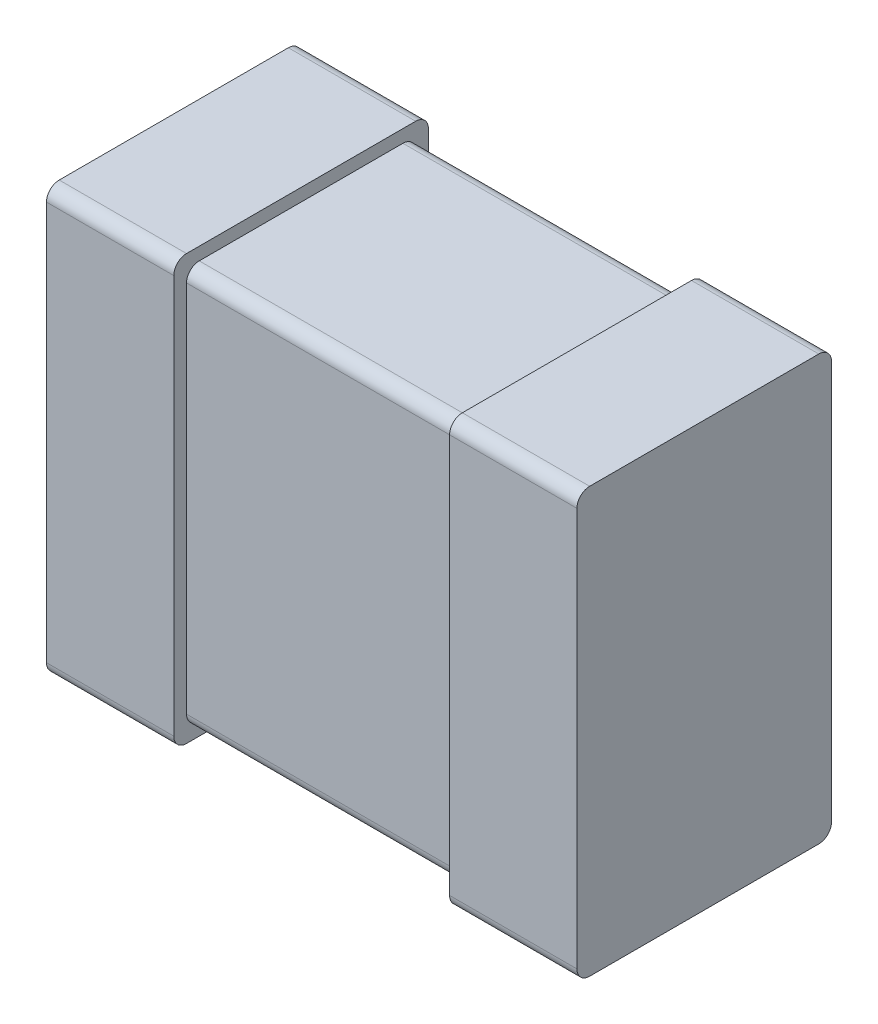
ISO-10303-21;
HEADER;
FILE_DESCRIPTION(('STEP AP214'),'2;1');
FILE_NAME('part.step','',(''),(''),'','','');
FILE_SCHEMA(('AUTOMOTIVE_DESIGN { 1 0 10303 214 1 1 1 1 }'));
ENDSEC;
DATA;
#1=APPLICATION_CONTEXT('core data for automotive mechanical design processes');
#2=APPLICATION_PROTOCOL_DEFINITION('international standard','automotive_design',2000,#1);
#3=PRODUCT_CONTEXT('',#1,'mechanical');
#4=PRODUCT('Part','Part','',(#3));
#5=PRODUCT_RELATED_PRODUCT_CATEGORY('part','',(#4));
#6=PRODUCT_DEFINITION_FORMATION('','',#4);
#7=PRODUCT_DEFINITION_CONTEXT('part definition',#1,'design');
#8=PRODUCT_DEFINITION('design','',#6,#7);
#9=PRODUCT_DEFINITION_SHAPE('','',#8);
#10=(LENGTH_UNIT() NAMED_UNIT(*) SI_UNIT(.MILLI.,.METRE.));
#11=(NAMED_UNIT(*) PLANE_ANGLE_UNIT() SI_UNIT($,.RADIAN.));
#12=(NAMED_UNIT(*) SI_UNIT($,.STERADIAN.) SOLID_ANGLE_UNIT());
#13=UNCERTAINTY_MEASURE_WITH_UNIT(LENGTH_MEASURE(1.E-05),#10,'distance_accuracy_value','');
#14=(GEOMETRIC_REPRESENTATION_CONTEXT(3) GLOBAL_UNCERTAINTY_ASSIGNED_CONTEXT((#13)) GLOBAL_UNIT_ASSIGNED_CONTEXT((#10,
#11,#12)) REPRESENTATION_CONTEXT('',''));
#15=CARTESIAN_POINT('',(0.,0.,0.));
#16=DIRECTION('',(0.,0.,1.));
#17=DIRECTION('',(1.,0.,0.));
#18=AXIS2_PLACEMENT_3D('',#15,#16,#17);
#19=CARTESIAN_POINT('',(1.25,-1.,0.));
#20=DIRECTION('',(1.,0.,0.));
#21=DIRECTION('',(0.,1.,0.));
#22=AXIS2_PLACEMENT_3D('',#19,#20,#21);
#23=PLANE('',#22);
#24=DIRECTION('',(0.,0.,1.));
#25=VECTOR('',#24,1.);
#26=CARTESIAN_POINT('',(1.25,-1.,0.));
#27=LINE('',#26,#25);
#28=CARTESIAN_POINT('',(1.25,-1.,0.06));
#29=VERTEX_POINT('',#28);
#30=CARTESIAN_POINT('',(1.25,-1.,1.14));
#31=VERTEX_POINT('',#30);
#32=EDGE_CURVE('E212',#29,#31,#27,.T.);
#33=ORIENTED_EDGE('',*,*,#32,.F.);
#34=CARTESIAN_POINT('',(1.25,-0.94,0.06));
#35=DIRECTION('',(1.,0.,0.));
#36=DIRECTION('',(0.,0.,1.));
#37=AXIS2_PLACEMENT_3D('',#34,#35,#36);
#38=CIRCLE('',#37,0.06);
#39=CARTESIAN_POINT('',(1.25,-0.94,0.));
#40=VERTEX_POINT('',#39);
#41=EDGE_CURVE('E221',#29,#40,#38,.T.);
#42=ORIENTED_EDGE('',*,*,#41,.T.);
#43=DIRECTION('',(0.,1.,0.));
#44=VECTOR('',#43,1.);
#45=CARTESIAN_POINT('',(1.25,-1.,0.));
#46=LINE('',#45,#44);
#47=CARTESIAN_POINT('',(1.25,0.94,0.));
#48=VERTEX_POINT('',#47);
#49=EDGE_CURVE('E421',#40,#48,#46,.T.);
#50=ORIENTED_EDGE('',*,*,#49,.T.);
#51=CARTESIAN_POINT('',(1.25,0.94,0.06));
#52=DIRECTION('',(-1.,0.,0.));
#53=DIRECTION('',(0.,0.,1.));
#54=AXIS2_PLACEMENT_3D('',#51,#52,#53);
#55=CIRCLE('',#54,0.06);
#56=CARTESIAN_POINT('',(1.25,1.,0.06));
#57=VERTEX_POINT('',#56);
#58=EDGE_CURVE('E253',#57,#48,#55,.T.);
#59=ORIENTED_EDGE('',*,*,#58,.F.);
#60=DIRECTION('',(0.,0.,1.));
#61=VECTOR('',#60,1.);
#62=CARTESIAN_POINT('',(1.25,1.,0.));
#63=LINE('',#62,#61);
#64=CARTESIAN_POINT('',(1.25,1.,1.14));
#65=VERTEX_POINT('',#64);
#66=EDGE_CURVE('E11',#57,#65,#63,.T.);
#67=ORIENTED_EDGE('',*,*,#66,.T.);
#68=CARTESIAN_POINT('',(1.25,0.94,1.14));
#69=DIRECTION('',(1.,0.,0.));
#70=DIRECTION('',(0.,0.,1.));
#71=AXIS2_PLACEMENT_3D('',#68,#69,#70);
#72=CIRCLE('',#71,0.06);
#73=CARTESIAN_POINT('',(1.25,0.94,1.2));
#74=VERTEX_POINT('',#73);
#75=EDGE_CURVE('E256',#65,#74,#72,.T.);
#76=ORIENTED_EDGE('',*,*,#75,.T.);
#77=DIRECTION('',(0.,1.,0.));
#78=VECTOR('',#77,1.);
#79=CARTESIAN_POINT('',(1.25,-1.,1.2));
#80=LINE('',#79,#78);
#81=CARTESIAN_POINT('',(1.25,-0.94,1.2));
#82=VERTEX_POINT('',#81);
#83=EDGE_CURVE('E215',#82,#74,#80,.T.);
#84=ORIENTED_EDGE('',*,*,#83,.F.);
#85=CARTESIAN_POINT('',(1.25,-0.94,1.14));
#86=DIRECTION('',(-1.,0.,0.));
#87=DIRECTION('',(0.,0.,1.));
#88=AXIS2_PLACEMENT_3D('',#85,#86,#87);
#89=CIRCLE('',#88,0.06);
#90=EDGE_CURVE('E209',#31,#82,#89,.T.);
#91=ORIENTED_EDGE('',*,*,#90,.F.);
#92=EDGE_LOOP('',(#33,#42,#50,#59,#67,#76,#84,#91));
#93=FACE_BOUND('',#92,.T.);
#94=ADVANCED_FACE('F16',(#93),#23,.T.);
#95=CARTESIAN_POINT('',(0.65,1.,0.));
#96=DIRECTION('',(0.,1.,0.));
#97=DIRECTION('',(1.,0.,0.));
#98=AXIS2_PLACEMENT_3D('',#95,#96,#97);
#99=PLANE('',#98);
#100=ORIENTED_EDGE('',*,*,#66,.F.);
#101=DIRECTION('',(1.,0.,0.));
#102=VECTOR('',#101,1.);
#103=CARTESIAN_POINT('',(0.65,1.,0.06));
#104=LINE('',#103,#102);
#105=CARTESIAN_POINT('',(0.65,1.,0.06));
#106=VERTEX_POINT('',#105);
#107=EDGE_CURVE('E257',#106,#57,#104,.T.);
#108=ORIENTED_EDGE('',*,*,#107,.F.);
#109=DIRECTION('',(0.,0.,1.));
#110=VECTOR('',#109,1.);
#111=CARTESIAN_POINT('',(0.65,1.,0.));
#112=LINE('',#111,#110);
#113=CARTESIAN_POINT('',(0.65,1.,1.14));
#114=VERTEX_POINT('',#113);
#115=EDGE_CURVE('E384',#106,#114,#112,.T.);
#116=ORIENTED_EDGE('',*,*,#115,.T.);
#117=DIRECTION('',(1.,0.,0.));
#118=VECTOR('',#117,1.);
#119=CARTESIAN_POINT('',(0.65,1.,1.14));
#120=LINE('',#119,#118);
#121=EDGE_CURVE('E27',#114,#65,#120,.T.);
#122=ORIENTED_EDGE('',*,*,#121,.T.);
#123=EDGE_LOOP('',(#100,#108,#116,#122));
#124=FACE_BOUND('',#123,.T.);
#125=ADVANCED_FACE('F925',(#124),#99,.T.);
#126=CARTESIAN_POINT('',(0.65,0.94,1.14));
#127=DIRECTION('',(1.,0.,0.));
#128=DIRECTION('',(0.,1.,0.));
#129=AXIS2_PLACEMENT_3D('',#126,#127,#128);
#130=CYLINDRICAL_SURFACE('',#129,0.06);
#131=CARTESIAN_POINT('',(0.65,0.94,1.14));
#132=DIRECTION('',(1.,0.,0.));
#133=DIRECTION('',(0.,0.,1.));
#134=AXIS2_PLACEMENT_3D('',#131,#132,#133);
#135=CIRCLE('',#134,0.06);
#136=CARTESIAN_POINT('',(0.65,0.94,1.2));
#137=VERTEX_POINT('',#136);
#138=EDGE_CURVE('E377',#114,#137,#135,.T.);
#139=ORIENTED_EDGE('',*,*,#138,.T.);
#140=DIRECTION('',(1.,0.,0.));
#141=VECTOR('',#140,1.);
#142=CARTESIAN_POINT('',(0.65,0.94,1.2));
#143=LINE('',#142,#141);
#144=EDGE_CURVE('E420',#137,#74,#143,.T.);
#145=ORIENTED_EDGE('',*,*,#144,.T.);
#146=ORIENTED_EDGE('',*,*,#75,.F.);
#147=ORIENTED_EDGE('',*,*,#121,.F.);
#148=EDGE_LOOP('',(#139,#145,#146,#147));
#149=FACE_BOUND('',#148,.T.);
#150=ADVANCED_FACE('F935',(#149),#130,.T.);
#151=CARTESIAN_POINT('',(0.65,0.94,0.06));
#152=DIRECTION('',(1.,0.,0.));
#153=DIRECTION('',(0.,1.,0.));
#154=AXIS2_PLACEMENT_3D('',#151,#152,#153);
#155=CYLINDRICAL_SURFACE('',#154,0.06);
#156=ORIENTED_EDGE('',*,*,#107,.T.);
#157=ORIENTED_EDGE('',*,*,#58,.T.);
#158=DIRECTION('',(1.,0.,0.));
#159=VECTOR('',#158,1.);
#160=CARTESIAN_POINT('',(0.65,0.94,0.));
#161=LINE('',#160,#159);
#162=CARTESIAN_POINT('',(0.65,0.94,0.));
#163=VERTEX_POINT('',#162);
#164=EDGE_CURVE('E404',#163,#48,#161,.T.);
#165=ORIENTED_EDGE('',*,*,#164,.F.);
#166=CARTESIAN_POINT('',(0.65,0.94,0.06));
#167=DIRECTION('',(-1.,0.,0.));
#168=DIRECTION('',(0.,0.,1.));
#169=AXIS2_PLACEMENT_3D('',#166,#167,#168);
#170=CIRCLE('',#169,0.06);
#171=EDGE_CURVE('E277',#106,#163,#170,.T.);
#172=ORIENTED_EDGE('',*,*,#171,.F.);
#173=EDGE_LOOP('',(#156,#157,#165,#172));
#174=FACE_BOUND('',#173,.T.);
#175=ADVANCED_FACE('F930',(#174),#155,.T.);
#176=CARTESIAN_POINT('',(0.65,-1.,1.2));
#177=DIRECTION('',(0.,0.,1.));
#178=DIRECTION('',(1.,0.,0.));
#179=AXIS2_PLACEMENT_3D('',#176,#177,#178);
#180=PLANE('',#179);
#181=DIRECTION('',(0.,1.,0.));
#182=VECTOR('',#181,1.);
#183=CARTESIAN_POINT('',(0.65,-1.,1.2));
#184=LINE('',#183,#182);
#185=CARTESIAN_POINT('',(0.65,-0.94,1.2));
#186=VERTEX_POINT('',#185);
#187=EDGE_CURVE('E373',#186,#137,#184,.T.);
#188=ORIENTED_EDGE('',*,*,#187,.F.);
#189=DIRECTION('',(1.,0.,0.));
#190=VECTOR('',#189,1.);
#191=CARTESIAN_POINT('',(0.65,-0.94,1.2));
#192=LINE('',#191,#190);
#193=EDGE_CURVE('E220',#186,#82,#192,.T.);
#194=ORIENTED_EDGE('',*,*,#193,.T.);
#195=ORIENTED_EDGE('',*,*,#83,.T.);
#196=ORIENTED_EDGE('',*,*,#144,.F.);
#197=EDGE_LOOP('',(#188,#194,#195,#196));
#198=FACE_BOUND('',#197,.T.);
#199=ADVANCED_FACE('F934',(#198),#180,.T.);
#200=CARTESIAN_POINT('',(0.65,-1.,0.));
#201=DIRECTION('',(0.,0.,1.));
#202=DIRECTION('',(1.,0.,0.));
#203=AXIS2_PLACEMENT_3D('',#200,#201,#202);
#204=PLANE('',#203);
#205=ORIENTED_EDGE('',*,*,#164,.T.);
#206=ORIENTED_EDGE('',*,*,#49,.F.);
#207=DIRECTION('',(1.,0.,0.));
#208=VECTOR('',#207,1.);
#209=CARTESIAN_POINT('',(0.65,-0.94,0.));
#210=LINE('',#209,#208);
#211=CARTESIAN_POINT('',(0.65,-0.94,0.));
#212=VERTEX_POINT('',#211);
#213=EDGE_CURVE('E230',#212,#40,#210,.T.);
#214=ORIENTED_EDGE('',*,*,#213,.F.);
#215=DIRECTION('',(0.,1.,0.));
#216=VECTOR('',#215,1.);
#217=CARTESIAN_POINT('',(0.65,-1.,0.));
#218=LINE('',#217,#216);
#219=EDGE_CURVE('E273',#212,#163,#218,.T.);
#220=ORIENTED_EDGE('',*,*,#219,.T.);
#221=EDGE_LOOP('',(#205,#206,#214,#220));
#222=FACE_BOUND('',#221,.T.);
#223=ADVANCED_FACE('F988',(#222),#204,.F.);
#224=CARTESIAN_POINT('',(0.65,-0.94,1.14));
#225=DIRECTION('',(1.,0.,0.));
#226=DIRECTION('',(0.,-1.,0.));
#227=AXIS2_PLACEMENT_3D('',#224,#225,#226);
#228=CYLINDRICAL_SURFACE('',#227,0.06);
#229=DIRECTION('',(1.,0.,0.));
#230=VECTOR('',#229,1.);
#231=CARTESIAN_POINT('',(0.65,-1.,1.14));
#232=LINE('',#231,#230);
#233=CARTESIAN_POINT('',(0.65,-1.,1.14));
#234=VERTEX_POINT('',#233);
#235=EDGE_CURVE('E226',#234,#31,#232,.T.);
#236=ORIENTED_EDGE('',*,*,#235,.T.);
#237=ORIENTED_EDGE('',*,*,#90,.T.);
#238=ORIENTED_EDGE('',*,*,#193,.F.);
#239=CARTESIAN_POINT('',(0.65,-0.94,1.14));
#240=DIRECTION('',(-1.,0.,0.));
#241=DIRECTION('',(0.,0.,1.));
#242=AXIS2_PLACEMENT_3D('',#239,#240,#241);
#243=CIRCLE('',#242,0.06);
#244=EDGE_CURVE('E235',#234,#186,#243,.T.);
#245=ORIENTED_EDGE('',*,*,#244,.F.);
#246=EDGE_LOOP('',(#236,#237,#238,#245));
#247=FACE_BOUND('',#246,.T.);
#248=ADVANCED_FACE('F233',(#247),#228,.T.);
#249=CARTESIAN_POINT('',(0.65,-0.94,0.06));
#250=DIRECTION('',(1.,0.,0.));
#251=DIRECTION('',(0.,-1.,0.));
#252=AXIS2_PLACEMENT_3D('',#249,#250,#251);
#253=CYLINDRICAL_SURFACE('',#252,0.06);
#254=CARTESIAN_POINT('',(0.65,-0.94,0.06));
#255=DIRECTION('',(1.,0.,0.));
#256=DIRECTION('',(0.,0.,1.));
#257=AXIS2_PLACEMENT_3D('',#254,#255,#256);
#258=CIRCLE('',#257,0.06);
#259=CARTESIAN_POINT('',(0.65,-1.,0.06));
#260=VERTEX_POINT('',#259);
#261=EDGE_CURVE('E245',#260,#212,#258,.T.);
#262=ORIENTED_EDGE('',*,*,#261,.T.);
#263=ORIENTED_EDGE('',*,*,#213,.T.);
#264=ORIENTED_EDGE('',*,*,#41,.F.);
#265=DIRECTION('',(1.,0.,0.));
#266=VECTOR('',#265,1.);
#267=CARTESIAN_POINT('',(0.65,-1.,0.06));
#268=LINE('',#267,#266);
#269=EDGE_CURVE('E228',#260,#29,#268,.T.);
#270=ORIENTED_EDGE('',*,*,#269,.F.);
#271=EDGE_LOOP('',(#262,#263,#264,#270));
#272=FACE_BOUND('',#271,.T.);
#273=ADVANCED_FACE('F878',(#272),#253,.T.);
#274=CARTESIAN_POINT('',(0.65,-1.,0.));
#275=DIRECTION('',(0.,1.,0.));
#276=DIRECTION('',(1.,0.,0.));
#277=AXIS2_PLACEMENT_3D('',#274,#275,#276);
#278=PLANE('',#277);
#279=ORIENTED_EDGE('',*,*,#235,.F.);
#280=DIRECTION('',(0.,0.,1.));
#281=VECTOR('',#280,1.);
#282=CARTESIAN_POINT('',(0.65,-1.,0.));
#283=LINE('',#282,#281);
#284=EDGE_CURVE('E237',#260,#234,#283,.T.);
#285=ORIENTED_EDGE('',*,*,#284,.F.);
#286=ORIENTED_EDGE('',*,*,#269,.T.);
#287=ORIENTED_EDGE('',*,*,#32,.T.);
#288=EDGE_LOOP('',(#279,#285,#286,#287));
#289=FACE_BOUND('',#288,.T.);
#290=ADVANCED_FACE('F224',(#289),#278,.F.);
#291=CARTESIAN_POINT('',(0.65,-1.,0.));
#292=DIRECTION('',(1.,0.,0.));
#293=DIRECTION('',(0.,1.,0.));
#294=AXIS2_PLACEMENT_3D('',#291,#292,#293);
#295=PLANE('',#294);
#296=DIRECTION('',(0.,1.,0.));
#297=VECTOR('',#296,1.);
#298=CARTESIAN_POINT('',(0.65,-0.94,0.06));
#299=LINE('',#298,#297);
#300=CARTESIAN_POINT('',(0.65,-0.88,0.06));
#301=VERTEX_POINT('',#300);
#302=CARTESIAN_POINT('',(0.65,0.88,0.06));
#303=VERTEX_POINT('',#302);
#304=EDGE_CURVE('E325',#301,#303,#299,.T.);
#305=ORIENTED_EDGE('',*,*,#304,.T.);
#306=CARTESIAN_POINT('',(0.65,0.88,0.12));
#307=DIRECTION('',(-1.,0.,0.));
#308=DIRECTION('',(0.,0.,1.));
#309=AXIS2_PLACEMENT_3D('',#306,#307,#308);
#310=CIRCLE('',#309,0.06);
#311=CARTESIAN_POINT('',(0.65,0.94,0.12));
#312=VERTEX_POINT('',#311);
#313=EDGE_CURVE('E370',#312,#303,#310,.T.);
#314=ORIENTED_EDGE('',*,*,#313,.F.);
#315=DIRECTION('',(0.,0.,1.));
#316=VECTOR('',#315,1.);
#317=CARTESIAN_POINT('',(0.65,0.94,0.06));
#318=LINE('',#317,#316);
#319=CARTESIAN_POINT('',(0.65,0.94,1.08));
#320=VERTEX_POINT('',#319);
#321=EDGE_CURVE('E363',#312,#320,#318,.T.);
#322=ORIENTED_EDGE('',*,*,#321,.T.);
#323=CARTESIAN_POINT('',(0.65,0.88,1.08));
#324=DIRECTION('',(1.,0.,0.));
#325=DIRECTION('',(0.,0.,1.));
#326=AXIS2_PLACEMENT_3D('',#323,#324,#325);
#327=CIRCLE('',#326,0.06);
#328=CARTESIAN_POINT('',(0.65,0.88,1.14));
#329=VERTEX_POINT('',#328);
#330=EDGE_CURVE('E262',#320,#329,#327,.T.);
#331=ORIENTED_EDGE('',*,*,#330,.T.);
#332=DIRECTION('',(0.,1.,0.));
#333=VECTOR('',#332,1.);
#334=CARTESIAN_POINT('',(0.65,-0.94,1.14));
#335=LINE('',#334,#333);
#336=CARTESIAN_POINT('',(0.65,-0.88,1.14));
#337=VERTEX_POINT('',#336);
#338=EDGE_CURVE('E294',#337,#329,#335,.T.);
#339=ORIENTED_EDGE('',*,*,#338,.F.);
#340=CARTESIAN_POINT('',(0.65,-0.88,1.08));
#341=DIRECTION('',(-1.,0.,0.));
#342=DIRECTION('',(0.,0.,1.));
#343=AXIS2_PLACEMENT_3D('',#340,#341,#342);
#344=CIRCLE('',#343,0.06);
#345=CARTESIAN_POINT('',(0.65,-0.94,1.08));
#346=VERTEX_POINT('',#345);
#347=EDGE_CURVE('E20',#346,#337,#344,.T.);
#348=ORIENTED_EDGE('',*,*,#347,.F.);
#349=DIRECTION('',(0.,0.,1.));
#350=VECTOR('',#349,1.);
#351=CARTESIAN_POINT('',(0.65,-0.94,0.06));
#352=LINE('',#351,#350);
#353=CARTESIAN_POINT('',(0.65,-0.94,0.12));
#354=VERTEX_POINT('',#353);
#355=EDGE_CURVE('E464',#354,#346,#352,.T.);
#356=ORIENTED_EDGE('',*,*,#355,.F.);
#357=CARTESIAN_POINT('',(0.65,-0.88,0.12));
#358=DIRECTION('',(1.,0.,0.));
#359=DIRECTION('',(0.,0.,1.));
#360=AXIS2_PLACEMENT_3D('',#357,#358,#359);
#361=CIRCLE('',#360,0.06);
#362=EDGE_CURVE('E324',#354,#301,#361,.T.);
#363=ORIENTED_EDGE('',*,*,#362,.T.);
#364=EDGE_LOOP('',(#305,#314,#322,#331,#339,#348,#356,#363));
#365=FACE_BOUND('',#364,.T.);
#366=ORIENTED_EDGE('',*,*,#244,.T.);
#367=ORIENTED_EDGE('',*,*,#187,.T.);
#368=ORIENTED_EDGE('',*,*,#138,.F.);
#369=ORIENTED_EDGE('',*,*,#115,.F.);
#370=ORIENTED_EDGE('',*,*,#171,.T.);
#371=ORIENTED_EDGE('',*,*,#219,.F.);
#372=ORIENTED_EDGE('',*,*,#261,.F.);
#373=ORIENTED_EDGE('',*,*,#284,.T.);
#374=EDGE_LOOP('',(#366,#367,#368,#369,#370,#371,#372,#373));
#375=FACE_BOUND('',#374,.T.);
#376=ADVANCED_FACE('F18',(#365,#375),#295,.F.);
#377=CARTESIAN_POINT('',(-0.65,-0.94,0.06));
#378=DIRECTION('',(0.,1.,0.));
#379=DIRECTION('',(1.,0.,0.));
#380=AXIS2_PLACEMENT_3D('',#377,#378,#379);
#381=PLANE('',#380);
#382=DIRECTION('',(1.,0.,0.));
#383=VECTOR('',#382,1.);
#384=CARTESIAN_POINT('',(-0.65,-0.94,1.08));
#385=LINE('',#384,#383);
#386=CARTESIAN_POINT('',(-0.65,-0.94,1.08));
#387=VERTEX_POINT('',#386);
#388=EDGE_CURVE('E297',#387,#346,#385,.T.);
#389=ORIENTED_EDGE('',*,*,#388,.F.);
#390=DIRECTION('',(0.,0.,1.));
#391=VECTOR('',#390,1.);
#392=CARTESIAN_POINT('',(-0.65,-0.94,0.06));
#393=LINE('',#392,#391);
#394=CARTESIAN_POINT('',(-0.65,-0.94,0.12));
#395=VERTEX_POINT('',#394);
#396=EDGE_CURVE('E310',#395,#387,#393,.T.);
#397=ORIENTED_EDGE('',*,*,#396,.F.);
#398=DIRECTION('',(1.,0.,0.));
#399=VECTOR('',#398,1.);
#400=CARTESIAN_POINT('',(-0.65,-0.94,0.12));
#401=LINE('',#400,#399);
#402=EDGE_CURVE('E319',#395,#354,#401,.T.);
#403=ORIENTED_EDGE('',*,*,#402,.T.);
#404=ORIENTED_EDGE('',*,*,#355,.T.);
#405=EDGE_LOOP('',(#389,#397,#403,#404));
#406=FACE_BOUND('',#405,.T.);
#407=ADVANCED_FACE('F532',(#406),#381,.F.);
#408=CARTESIAN_POINT('',(-0.65,-0.88,1.08));
#409=DIRECTION('',(1.,0.,0.));
#410=DIRECTION('',(0.,-1.,0.));
#411=AXIS2_PLACEMENT_3D('',#408,#409,#410);
#412=CYLINDRICAL_SURFACE('',#411,0.06);
#413=ORIENTED_EDGE('',*,*,#388,.T.);
#414=ORIENTED_EDGE('',*,*,#347,.T.);
#415=DIRECTION('',(1.,0.,0.));
#416=VECTOR('',#415,1.);
#417=CARTESIAN_POINT('',(-0.65,-0.88,1.14));
#418=LINE('',#417,#416);
#419=CARTESIAN_POINT('',(-0.65,-0.88,1.14));
#420=VERTEX_POINT('',#419);
#421=EDGE_CURVE('E293',#420,#337,#418,.T.);
#422=ORIENTED_EDGE('',*,*,#421,.F.);
#423=CARTESIAN_POINT('',(-0.65,-0.88,1.08));
#424=DIRECTION('',(-1.,0.,0.));
#425=DIRECTION('',(0.,0.,1.));
#426=AXIS2_PLACEMENT_3D('',#423,#424,#425);
#427=CIRCLE('',#426,0.06);
#428=EDGE_CURVE('E289',#387,#420,#427,.T.);
#429=ORIENTED_EDGE('',*,*,#428,.F.);
#430=EDGE_LOOP('',(#413,#414,#422,#429));
#431=FACE_BOUND('',#430,.T.);
#432=ADVANCED_FACE('F556',(#431),#412,.T.);
#433=CARTESIAN_POINT('',(-0.65,-0.94,1.14));
#434=DIRECTION('',(0.,0.,1.));
#435=DIRECTION('',(1.,0.,0.));
#436=AXIS2_PLACEMENT_3D('',#433,#434,#435);
#437=PLANE('',#436);
#438=DIRECTION('',(0.,1.,0.));
#439=VECTOR('',#438,1.);
#440=CARTESIAN_POINT('',(-0.65,-0.94,1.14));
#441=LINE('',#440,#439);
#442=CARTESIAN_POINT('',(-0.65,0.88,1.14));
#443=VERTEX_POINT('',#442);
#444=EDGE_CURVE('E284',#420,#443,#441,.T.);
#445=ORIENTED_EDGE('',*,*,#444,.F.);
#446=ORIENTED_EDGE('',*,*,#421,.T.);
#447=ORIENTED_EDGE('',*,*,#338,.T.);
#448=DIRECTION('',(1.,0.,0.));
#449=VECTOR('',#448,1.);
#450=CARTESIAN_POINT('',(-0.65,0.88,1.14));
#451=LINE('',#450,#449);
#452=EDGE_CURVE('E258',#443,#329,#451,.T.);
#453=ORIENTED_EDGE('',*,*,#452,.F.);
#454=EDGE_LOOP('',(#445,#446,#447,#453));
#455=FACE_BOUND('',#454,.T.);
#456=ADVANCED_FACE('F553',(#455),#437,.T.);
#457=CARTESIAN_POINT('',(-0.65,0.88,1.08));
#458=DIRECTION('',(1.,0.,0.));
#459=DIRECTION('',(0.,1.,0.));
#460=AXIS2_PLACEMENT_3D('',#457,#458,#459);
#461=CYLINDRICAL_SURFACE('',#460,0.06);
#462=CARTESIAN_POINT('',(-0.65,0.88,1.08));
#463=DIRECTION('',(1.,0.,0.));
#464=DIRECTION('',(0.,0.,1.));
#465=AXIS2_PLACEMENT_3D('',#462,#463,#464);
#466=CIRCLE('',#465,0.06);
#467=CARTESIAN_POINT('',(-0.65,0.94,1.08));
#468=VERTEX_POINT('',#467);
#469=EDGE_CURVE('E288',#468,#443,#466,.T.);
#470=ORIENTED_EDGE('',*,*,#469,.T.);
#471=ORIENTED_EDGE('',*,*,#452,.T.);
#472=ORIENTED_EDGE('',*,*,#330,.F.);
#473=DIRECTION('',(1.,0.,0.));
#474=VECTOR('',#473,1.);
#475=CARTESIAN_POINT('',(-0.65,0.94,1.08));
#476=LINE('',#475,#474);
#477=EDGE_CURVE('E263',#468,#320,#476,.T.);
#478=ORIENTED_EDGE('',*,*,#477,.F.);
#479=EDGE_LOOP('',(#470,#471,#472,#478));
#480=FACE_BOUND('',#479,.T.);
#481=ADVANCED_FACE('F550',(#480),#461,.T.);
#482=CARTESIAN_POINT('',(-0.65,0.94,0.06));
#483=DIRECTION('',(0.,1.,0.));
#484=DIRECTION('',(1.,0.,0.));
#485=AXIS2_PLACEMENT_3D('',#482,#483,#484);
#486=PLANE('',#485);
#487=ORIENTED_EDGE('',*,*,#321,.F.);
#488=DIRECTION('',(1.,0.,0.));
#489=VECTOR('',#488,1.);
#490=CARTESIAN_POINT('',(-0.65,0.94,0.12));
#491=LINE('',#490,#489);
#492=CARTESIAN_POINT('',(-0.65,0.94,0.12));
#493=VERTEX_POINT('',#492);
#494=EDGE_CURVE('E329',#493,#312,#491,.T.);
#495=ORIENTED_EDGE('',*,*,#494,.F.);
#496=DIRECTION('',(0.,0.,1.));
#497=VECTOR('',#496,1.);
#498=CARTESIAN_POINT('',(-0.65,0.94,0.06));
#499=LINE('',#498,#497);
#500=EDGE_CURVE('E283',#493,#468,#499,.T.);
#501=ORIENTED_EDGE('',*,*,#500,.T.);
#502=ORIENTED_EDGE('',*,*,#477,.T.);
#503=EDGE_LOOP('',(#487,#495,#501,#502));
#504=FACE_BOUND('',#503,.T.);
#505=ADVANCED_FACE('F548',(#504),#486,.T.);
#506=CARTESIAN_POINT('',(-0.65,0.88,0.12));
#507=DIRECTION('',(1.,0.,0.));
#508=DIRECTION('',(0.,1.,0.));
#509=AXIS2_PLACEMENT_3D('',#506,#507,#508);
#510=CYLINDRICAL_SURFACE('',#509,0.06);
#511=ORIENTED_EDGE('',*,*,#494,.T.);
#512=ORIENTED_EDGE('',*,*,#313,.T.);
#513=DIRECTION('',(1.,0.,0.));
#514=VECTOR('',#513,1.);
#515=CARTESIAN_POINT('',(-0.65,0.88,0.06));
#516=LINE('',#515,#514);
#517=CARTESIAN_POINT('',(-0.65,0.88,0.06));
#518=VERTEX_POINT('',#517);
#519=EDGE_CURVE('E323',#518,#303,#516,.T.);
#520=ORIENTED_EDGE('',*,*,#519,.F.);
#521=CARTESIAN_POINT('',(-0.65,0.88,0.12));
#522=DIRECTION('',(-1.,0.,0.));
#523=DIRECTION('',(0.,0.,1.));
#524=AXIS2_PLACEMENT_3D('',#521,#522,#523);
#525=CIRCLE('',#524,0.06);
#526=EDGE_CURVE('E278',#493,#518,#525,.T.);
#527=ORIENTED_EDGE('',*,*,#526,.F.);
#528=EDGE_LOOP('',(#511,#512,#520,#527));
#529=FACE_BOUND('',#528,.T.);
#530=ADVANCED_FACE('F545',(#529),#510,.T.);
#531=CARTESIAN_POINT('',(-0.65,-0.94,0.06));
#532=DIRECTION('',(0.,0.,1.));
#533=DIRECTION('',(1.,0.,0.));
#534=AXIS2_PLACEMENT_3D('',#531,#532,#533);
#535=PLANE('',#534);
#536=ORIENTED_EDGE('',*,*,#519,.T.);
#537=ORIENTED_EDGE('',*,*,#304,.F.);
#538=DIRECTION('',(1.,0.,0.));
#539=VECTOR('',#538,1.);
#540=CARTESIAN_POINT('',(-0.65,-0.88,0.06));
#541=LINE('',#540,#539);
#542=CARTESIAN_POINT('',(-0.65,-0.88,0.06));
#543=VERTEX_POINT('',#542);
#544=EDGE_CURVE('E354',#543,#301,#541,.T.);
#545=ORIENTED_EDGE('',*,*,#544,.F.);
#546=DIRECTION('',(0.,1.,0.));
#547=VECTOR('',#546,1.);
#548=CARTESIAN_POINT('',(-0.65,-0.94,0.06));
#549=LINE('',#548,#547);
#550=EDGE_CURVE('E282',#543,#518,#549,.T.);
#551=ORIENTED_EDGE('',*,*,#550,.T.);
#552=EDGE_LOOP('',(#536,#537,#545,#551));
#553=FACE_BOUND('',#552,.T.);
#554=ADVANCED_FACE('F538',(#553),#535,.F.);
#555=CARTESIAN_POINT('',(-0.65,-0.88,0.12));
#556=DIRECTION('',(1.,0.,0.));
#557=DIRECTION('',(0.,-1.,0.));
#558=AXIS2_PLACEMENT_3D('',#555,#556,#557);
#559=CYLINDRICAL_SURFACE('',#558,0.06);
#560=CARTESIAN_POINT('',(-0.65,-0.88,0.12));
#561=DIRECTION('',(1.,0.,0.));
#562=DIRECTION('',(0.,0.,1.));
#563=AXIS2_PLACEMENT_3D('',#560,#561,#562);
#564=CIRCLE('',#563,0.06);
#565=EDGE_CURVE('E314',#395,#543,#564,.T.);
#566=ORIENTED_EDGE('',*,*,#565,.T.);
#567=ORIENTED_EDGE('',*,*,#544,.T.);
#568=ORIENTED_EDGE('',*,*,#362,.F.);
#569=ORIENTED_EDGE('',*,*,#402,.F.);
#570=EDGE_LOOP('',(#566,#567,#568,#569));
#571=FACE_BOUND('',#570,.T.);
#572=ADVANCED_FACE('F535',(#571),#559,.T.);
#573=CARTESIAN_POINT('',(-0.65,-1.,0.));
#574=DIRECTION('',(1.,0.,0.));
#575=DIRECTION('',(0.,1.,0.));
#576=AXIS2_PLACEMENT_3D('',#573,#574,#575);
#577=PLANE('',#576);
#578=ORIENTED_EDGE('',*,*,#565,.F.);
#579=ORIENTED_EDGE('',*,*,#396,.T.);
#580=ORIENTED_EDGE('',*,*,#428,.T.);
#581=ORIENTED_EDGE('',*,*,#444,.T.);
#582=ORIENTED_EDGE('',*,*,#469,.F.);
#583=ORIENTED_EDGE('',*,*,#500,.F.);
#584=ORIENTED_EDGE('',*,*,#526,.T.);
#585=ORIENTED_EDGE('',*,*,#550,.F.);
#586=EDGE_LOOP('',(#578,#579,#580,#581,#582,#583,#584,#585));
#587=FACE_BOUND('',#586,.T.);
#588=DIRECTION('',(0.,0.,1.));
#589=VECTOR('',#588,1.);
#590=CARTESIAN_POINT('',(-0.65,-1.,0.));
#591=LINE('',#590,#589);
#592=CARTESIAN_POINT('',(-0.65,-1.,0.06));
#593=VERTEX_POINT('',#592);
#594=CARTESIAN_POINT('',(-0.65,-1.,1.14));
#595=VERTEX_POINT('',#594);
#596=EDGE_CURVE('E303',#593,#595,#591,.T.);
#597=ORIENTED_EDGE('',*,*,#596,.F.);
#598=CARTESIAN_POINT('',(-0.65,-0.94,0.06));
#599=DIRECTION('',(1.,0.,0.));
#600=DIRECTION('',(0.,0.,1.));
#601=AXIS2_PLACEMENT_3D('',#598,#599,#600);
#602=CIRCLE('',#601,0.06);
#603=CARTESIAN_POINT('',(-0.65,-0.94,0.));
#604=VERTEX_POINT('',#603);
#605=EDGE_CURVE('E302',#593,#604,#602,.T.);
#606=ORIENTED_EDGE('',*,*,#605,.T.);
#607=DIRECTION('',(0.,1.,0.));
#608=VECTOR('',#607,1.);
#609=CARTESIAN_POINT('',(-0.65,-1.,0.));
#610=LINE('',#609,#608);
#611=CARTESIAN_POINT('',(-0.65,0.94,0.));
#612=VERTEX_POINT('',#611);
#613=EDGE_CURVE('E309',#604,#612,#610,.T.);
#614=ORIENTED_EDGE('',*,*,#613,.T.);
#615=CARTESIAN_POINT('',(-0.65,0.94,0.06));
#616=DIRECTION('',(-1.,0.,0.));
#617=DIRECTION('',(0.,0.,1.));
#618=AXIS2_PLACEMENT_3D('',#615,#616,#617);
#619=CIRCLE('',#618,0.06);
#620=CARTESIAN_POINT('',(-0.65,1.,0.06));
#621=VERTEX_POINT('',#620);
#622=EDGE_CURVE('E248',#621,#612,#619,.T.);
#623=ORIENTED_EDGE('',*,*,#622,.F.);
#624=DIRECTION('',(0.,0.,1.));
#625=VECTOR('',#624,1.);
#626=CARTESIAN_POINT('',(-0.65,1.,0.));
#627=LINE('',#626,#625);
#628=CARTESIAN_POINT('',(-0.65,1.,1.14));
#629=VERTEX_POINT('',#628);
#630=EDGE_CURVE('E408',#621,#629,#627,.T.);
#631=ORIENTED_EDGE('',*,*,#630,.T.);
#632=CARTESIAN_POINT('',(-0.65,0.94,1.14));
#633=DIRECTION('',(1.,0.,0.));
#634=DIRECTION('',(0.,0.,1.));
#635=AXIS2_PLACEMENT_3D('',#632,#633,#634);
#636=CIRCLE('',#635,0.06);
#637=CARTESIAN_POINT('',(-0.65,0.94,1.2));
#638=VERTEX_POINT('',#637);
#639=EDGE_CURVE('E251',#629,#638,#636,.T.);
#640=ORIENTED_EDGE('',*,*,#639,.T.);
#641=DIRECTION('',(0.,1.,0.));
#642=VECTOR('',#641,1.);
#643=CARTESIAN_POINT('',(-0.65,-1.,1.2));
#644=LINE('',#643,#642);
#645=CARTESIAN_POINT('',(-0.65,-0.94,1.2));
#646=VERTEX_POINT('',#645);
#647=EDGE_CURVE('E304',#646,#638,#644,.T.);
#648=ORIENTED_EDGE('',*,*,#647,.F.);
#649=CARTESIAN_POINT('',(-0.65,-0.94,1.14));
#650=DIRECTION('',(-1.,0.,0.));
#651=DIRECTION('',(0.,0.,1.));
#652=AXIS2_PLACEMENT_3D('',#649,#650,#651);
#653=CIRCLE('',#652,0.06);
#654=EDGE_CURVE('E401',#595,#646,#653,.T.);
#655=ORIENTED_EDGE('',*,*,#654,.F.);
#656=EDGE_LOOP('',(#597,#606,#614,#623,#631,#640,#648,#655));
#657=FACE_BOUND('',#656,.T.);
#658=ADVANCED_FACE('F491',(#587,#657),#577,.T.);
#659=CARTESIAN_POINT('',(-1.25,1.,0.));
#660=DIRECTION('',(0.,1.,0.));
#661=DIRECTION('',(1.,0.,0.));
#662=AXIS2_PLACEMENT_3D('',#659,#660,#661);
#663=PLANE('',#662);
#664=ORIENTED_EDGE('',*,*,#630,.F.);
#665=DIRECTION('',(1.,0.,0.));
#666=VECTOR('',#665,1.);
#667=CARTESIAN_POINT('',(-1.25,1.,0.06));
#668=LINE('',#667,#666);
#669=CARTESIAN_POINT('',(-1.25,1.,0.06));
#670=VERTEX_POINT('',#669);
#671=EDGE_CURVE('E252',#670,#621,#668,.T.);
#672=ORIENTED_EDGE('',*,*,#671,.F.);
#673=DIRECTION('',(0.,0.,1.));
#674=VECTOR('',#673,1.);
#675=CARTESIAN_POINT('',(-1.25,1.,0.));
#676=LINE('',#675,#674);
#677=CARTESIAN_POINT('',(-1.25,1.,1.14));
#678=VERTEX_POINT('',#677);
#679=EDGE_CURVE('E344',#670,#678,#676,.T.);
#680=ORIENTED_EDGE('',*,*,#679,.T.);
#681=DIRECTION('',(1.,0.,0.));
#682=VECTOR('',#681,1.);
#683=CARTESIAN_POINT('',(-1.25,1.,1.14));
#684=LINE('',#683,#682);
#685=EDGE_CURVE('E266',#678,#629,#684,.T.);
#686=ORIENTED_EDGE('',*,*,#685,.T.);
#687=EDGE_LOOP('',(#664,#672,#680,#686));
#688=FACE_BOUND('',#687,.T.);
#689=ADVANCED_FACE('F495',(#688),#663,.T.);
#690=CARTESIAN_POINT('',(-1.25,0.94,1.14));
#691=DIRECTION('',(1.,0.,0.));
#692=DIRECTION('',(0.,1.,0.));
#693=AXIS2_PLACEMENT_3D('',#690,#691,#692);
#694=CYLINDRICAL_SURFACE('',#693,0.06);
#695=CARTESIAN_POINT('',(-1.25,0.94,1.14));
#696=DIRECTION('',(1.,0.,0.));
#697=DIRECTION('',(0.,0.,1.));
#698=AXIS2_PLACEMENT_3D('',#695,#696,#697);
#699=CIRCLE('',#698,0.06);
#700=CARTESIAN_POINT('',(-1.25,0.94,1.2));
#701=VERTEX_POINT('',#700);
#702=EDGE_CURVE('E334',#678,#701,#699,.T.);
#703=ORIENTED_EDGE('',*,*,#702,.T.);
#704=DIRECTION('',(1.,0.,0.));
#705=VECTOR('',#704,1.);
#706=CARTESIAN_POINT('',(-1.25,0.94,1.2));
#707=LINE('',#706,#705);
#708=EDGE_CURVE('E308',#701,#638,#707,.T.);
#709=ORIENTED_EDGE('',*,*,#708,.T.);
#710=ORIENTED_EDGE('',*,*,#639,.F.);
#711=ORIENTED_EDGE('',*,*,#685,.F.);
#712=EDGE_LOOP('',(#703,#709,#710,#711));
#713=FACE_BOUND('',#712,.T.);
#714=ADVANCED_FACE('F499',(#713),#694,.T.);
#715=CARTESIAN_POINT('',(-1.25,0.94,0.06));
#716=DIRECTION('',(1.,0.,0.));
#717=DIRECTION('',(0.,1.,0.));
#718=AXIS2_PLACEMENT_3D('',#715,#716,#717);
#719=CYLINDRICAL_SURFACE('',#718,0.06);
#720=ORIENTED_EDGE('',*,*,#671,.T.);
#721=ORIENTED_EDGE('',*,*,#622,.T.);
#722=DIRECTION('',(1.,0.,0.));
#723=VECTOR('',#722,1.);
#724=CARTESIAN_POINT('',(-1.25,0.94,0.));
#725=LINE('',#724,#723);
#726=CARTESIAN_POINT('',(-1.25,0.94,0.));
#727=VERTEX_POINT('',#726);
#728=EDGE_CURVE('E317',#727,#612,#725,.T.);
#729=ORIENTED_EDGE('',*,*,#728,.F.);
#730=CARTESIAN_POINT('',(-1.25,0.94,0.06));
#731=DIRECTION('',(-1.,0.,0.));
#732=DIRECTION('',(0.,0.,1.));
#733=AXIS2_PLACEMENT_3D('',#730,#731,#732);
#734=CIRCLE('',#733,0.06);
#735=EDGE_CURVE('E272',#670,#727,#734,.T.);
#736=ORIENTED_EDGE('',*,*,#735,.F.);
#737=EDGE_LOOP('',(#720,#721,#729,#736));
#738=FACE_BOUND('',#737,.T.);
#739=ADVANCED_FACE('F886',(#738),#719,.T.);
#740=CARTESIAN_POINT('',(-1.25,-1.,1.2));
#741=DIRECTION('',(0.,0.,1.));
#742=DIRECTION('',(1.,0.,0.));
#743=AXIS2_PLACEMENT_3D('',#740,#741,#742);
#744=PLANE('',#743);
#745=DIRECTION('',(0.,1.,0.));
#746=VECTOR('',#745,1.);
#747=CARTESIAN_POINT('',(-1.25,-1.,1.2));
#748=LINE('',#747,#746);
#749=CARTESIAN_POINT('',(-1.25,-0.94,1.2));
#750=VERTEX_POINT('',#749);
#751=EDGE_CURVE('E330',#750,#701,#748,.T.);
#752=ORIENTED_EDGE('',*,*,#751,.F.);
#753=DIRECTION('',(1.,0.,0.));
#754=VECTOR('',#753,1.);
#755=CARTESIAN_POINT('',(-1.25,-0.94,1.2));
#756=LINE('',#755,#754);
#757=EDGE_CURVE('E397',#750,#646,#756,.T.);
#758=ORIENTED_EDGE('',*,*,#757,.T.);
#759=ORIENTED_EDGE('',*,*,#647,.T.);
#760=ORIENTED_EDGE('',*,*,#708,.F.);
#761=EDGE_LOOP('',(#752,#758,#759,#760));
#762=FACE_BOUND('',#761,.T.);
#763=ADVANCED_FACE('F502',(#762),#744,.T.);
#764=CARTESIAN_POINT('',(-1.25,-1.,0.));
#765=DIRECTION('',(0.,0.,1.));
#766=DIRECTION('',(1.,0.,0.));
#767=AXIS2_PLACEMENT_3D('',#764,#765,#766);
#768=PLANE('',#767);
#769=ORIENTED_EDGE('',*,*,#728,.T.);
#770=ORIENTED_EDGE('',*,*,#613,.F.);
#771=DIRECTION('',(1.,0.,0.));
#772=VECTOR('',#771,1.);
#773=CARTESIAN_POINT('',(-1.25,-0.94,0.));
#774=LINE('',#773,#772);
#775=CARTESIAN_POINT('',(-1.25,-0.94,0.));
#776=VERTEX_POINT('',#775);
#777=EDGE_CURVE('E298',#776,#604,#774,.T.);
#778=ORIENTED_EDGE('',*,*,#777,.F.);
#779=DIRECTION('',(0.,1.,0.));
#780=VECTOR('',#779,1.);
#781=CARTESIAN_POINT('',(-1.25,-1.,0.));
#782=LINE('',#781,#780);
#783=EDGE_CURVE('E267',#776,#727,#782,.T.);
#784=ORIENTED_EDGE('',*,*,#783,.T.);
#785=EDGE_LOOP('',(#769,#770,#778,#784));
#786=FACE_BOUND('',#785,.T.);
#787=ADVANCED_FACE('F870',(#786),#768,.F.);
#788=CARTESIAN_POINT('',(-1.25,-0.94,1.14));
#789=DIRECTION('',(1.,0.,0.));
#790=DIRECTION('',(0.,-1.,0.));
#791=AXIS2_PLACEMENT_3D('',#788,#789,#790);
#792=CYLINDRICAL_SURFACE('',#791,0.06);
#793=DIRECTION('',(1.,0.,0.));
#794=VECTOR('',#793,1.);
#795=CARTESIAN_POINT('',(-1.25,-1.,1.14));
#796=LINE('',#795,#794);
#797=CARTESIAN_POINT('',(-1.25,-1.,1.14));
#798=VERTEX_POINT('',#797);
#799=EDGE_CURVE('E388',#798,#595,#796,.T.);
#800=ORIENTED_EDGE('',*,*,#799,.T.);
#801=ORIENTED_EDGE('',*,*,#654,.T.);
#802=ORIENTED_EDGE('',*,*,#757,.F.);
#803=CARTESIAN_POINT('',(-1.25,-0.94,1.14));
#804=DIRECTION('',(-1.,0.,0.));
#805=DIRECTION('',(0.,0.,1.));
#806=AXIS2_PLACEMENT_3D('',#803,#804,#805);
#807=CIRCLE('',#806,0.06);
#808=EDGE_CURVE('E335',#798,#750,#807,.T.);
#809=ORIENTED_EDGE('',*,*,#808,.F.);
#810=EDGE_LOOP('',(#800,#801,#802,#809));
#811=FACE_BOUND('',#810,.T.);
#812=ADVANCED_FACE('F509',(#811),#792,.T.);
#813=CARTESIAN_POINT('',(-1.25,-0.94,0.06));
#814=DIRECTION('',(1.,0.,0.));
#815=DIRECTION('',(0.,-1.,0.));
#816=AXIS2_PLACEMENT_3D('',#813,#814,#815);
#817=CYLINDRICAL_SURFACE('',#816,0.06);
#818=CARTESIAN_POINT('',(-1.25,-0.94,0.06));
#819=DIRECTION('',(1.,0.,0.));
#820=DIRECTION('',(0.,0.,1.));
#821=AXIS2_PLACEMENT_3D('',#818,#819,#820);
#822=CIRCLE('',#821,0.06);
#823=CARTESIAN_POINT('',(-1.25,-1.,0.06));
#824=VERTEX_POINT('',#823);
#825=EDGE_CURVE('E271',#824,#776,#822,.T.);
#826=ORIENTED_EDGE('',*,*,#825,.T.);
#827=ORIENTED_EDGE('',*,*,#777,.T.);
#828=ORIENTED_EDGE('',*,*,#605,.F.);
#829=DIRECTION('',(1.,0.,0.));
#830=VECTOR('',#829,1.);
#831=CARTESIAN_POINT('',(-1.25,-1.,0.06));
#832=LINE('',#831,#830);
#833=EDGE_CURVE('E392',#824,#593,#832,.T.);
#834=ORIENTED_EDGE('',*,*,#833,.F.);
#835=EDGE_LOOP('',(#826,#827,#828,#834));
#836=FACE_BOUND('',#835,.T.);
#837=ADVANCED_FACE('F869',(#836),#817,.T.);
#838=CARTESIAN_POINT('',(-1.25,-1.,0.));
#839=DIRECTION('',(0.,1.,0.));
#840=DIRECTION('',(1.,0.,0.));
#841=AXIS2_PLACEMENT_3D('',#838,#839,#840);
#842=PLANE('',#841);
#843=ORIENTED_EDGE('',*,*,#799,.F.);
#844=DIRECTION('',(0.,0.,1.));
#845=VECTOR('',#844,1.);
#846=CARTESIAN_POINT('',(-1.25,-1.,0.));
#847=LINE('',#846,#845);
#848=EDGE_CURVE('E393',#824,#798,#847,.T.);
#849=ORIENTED_EDGE('',*,*,#848,.F.);
#850=ORIENTED_EDGE('',*,*,#833,.T.);
#851=ORIENTED_EDGE('',*,*,#596,.T.);
#852=EDGE_LOOP('',(#843,#849,#850,#851));
#853=FACE_BOUND('',#852,.T.);
#854=ADVANCED_FACE('F506',(#853),#842,.F.);
#855=CARTESIAN_POINT('',(-1.25,-1.,0.));
#856=DIRECTION('',(1.,0.,0.));
#857=DIRECTION('',(0.,1.,0.));
#858=AXIS2_PLACEMENT_3D('',#855,#856,#857);
#859=PLANE('',#858);
#860=ORIENTED_EDGE('',*,*,#808,.T.);
#861=ORIENTED_EDGE('',*,*,#751,.T.);
#862=ORIENTED_EDGE('',*,*,#702,.F.);
#863=ORIENTED_EDGE('',*,*,#679,.F.);
#864=ORIENTED_EDGE('',*,*,#735,.T.);
#865=ORIENTED_EDGE('',*,*,#783,.F.);
#866=ORIENTED_EDGE('',*,*,#825,.F.);
#867=ORIENTED_EDGE('',*,*,#848,.T.);
#868=EDGE_LOOP('',(#860,#861,#862,#863,#864,#865,#866,#867));
#869=FACE_BOUND('',#868,.T.);
#870=ADVANCED_FACE('F511',(#869),#859,.F.);
#871=CLOSED_SHELL('',(#94,#125,#150,#175,#199,#223,#248,#273,#290,#376,#407,#432,#456,#481,#505,
#530,#554,#572,#658,#689,#714,#739,#763,#787,#812,#837,#854,#870));
#872=MANIFOLD_SOLID_BREP('B1',#871);
#873=ADVANCED_BREP_SHAPE_REPRESENTATION('',(#18,#872),#14);
#874=SHAPE_DEFINITION_REPRESENTATION(#9,#873);
ENDSEC;
END-ISO-10303-21;
